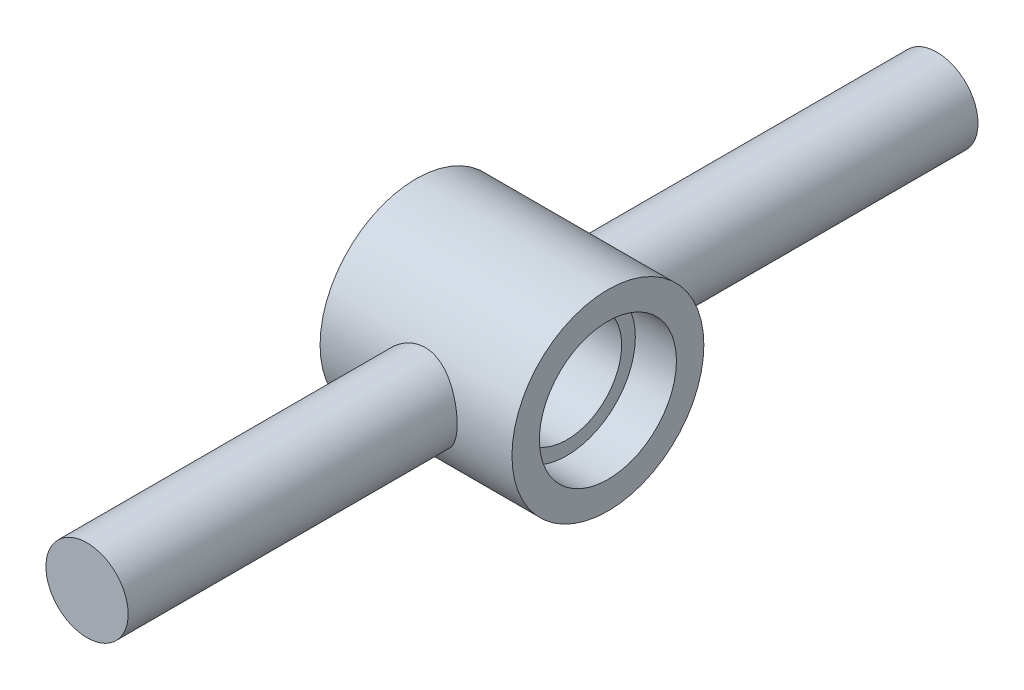
ISO-10303-21;
HEADER;
FILE_DESCRIPTION(('STEP AP214'),'2;1');
FILE_NAME('part.step','',(''),(''),'','','');
FILE_SCHEMA(('AUTOMOTIVE_DESIGN { 1 0 10303 214 1 1 1 1 }'));
ENDSEC;
DATA;
#1=APPLICATION_CONTEXT('core data for automotive mechanical design processes');
#2=APPLICATION_PROTOCOL_DEFINITION('international standard','automotive_design',2000,#1);
#3=PRODUCT_CONTEXT('',#1,'mechanical');
#4=PRODUCT('Part','Part','',(#3));
#5=PRODUCT_RELATED_PRODUCT_CATEGORY('part','',(#4));
#6=PRODUCT_DEFINITION_FORMATION('','',#4);
#7=PRODUCT_DEFINITION_CONTEXT('part definition',#1,'design');
#8=PRODUCT_DEFINITION('design','',#6,#7);
#9=PRODUCT_DEFINITION_SHAPE('','',#8);
#10=(LENGTH_UNIT() NAMED_UNIT(*) SI_UNIT(.MILLI.,.METRE.));
#11=(NAMED_UNIT(*) PLANE_ANGLE_UNIT() SI_UNIT($,.RADIAN.));
#12=(NAMED_UNIT(*) SI_UNIT($,.STERADIAN.) SOLID_ANGLE_UNIT());
#13=UNCERTAINTY_MEASURE_WITH_UNIT(LENGTH_MEASURE(1.E-05),#10,'distance_accuracy_value','');
#14=(GEOMETRIC_REPRESENTATION_CONTEXT(3) GLOBAL_UNCERTAINTY_ASSIGNED_CONTEXT((#13)) GLOBAL_UNIT_ASSIGNED_CONTEXT((#10,
#11,#12)) REPRESENTATION_CONTEXT('',''));
#15=CARTESIAN_POINT('',(0.,0.,0.));
#16=DIRECTION('',(0.,0.,1.));
#17=DIRECTION('',(1.,0.,0.));
#18=AXIS2_PLACEMENT_3D('',#15,#16,#17);
#19=CARTESIAN_POINT('',(-7.,0.,0.));
#20=DIRECTION('',(1.,0.,0.));
#21=DIRECTION('',(0.,0.,-1.));
#22=AXIS2_PLACEMENT_3D('',#19,#20,#21);
#23=CYLINDRICAL_SURFACE('',#22,4.);
#24=CARTESIAN_POINT('',(4.,0.,0.));
#25=DIRECTION('',(1.,0.,0.));
#26=DIRECTION('',(0.,0.,-1.));
#27=AXIS2_PLACEMENT_3D('',#24,#25,#26);
#28=CIRCLE('',#27,4.);
#29=CARTESIAN_POINT('',(4.,0.,-4.));
#30=VERTEX_POINT('',#29);
#31=EDGE_CURVE('E64',#30,#30,#28,.F.);
#32=ORIENTED_EDGE('',*,*,#31,.F.);
#33=EDGE_LOOP('',(#32));
#34=FACE_BOUND('',#33,.T.);
#35=CARTESIAN_POINT('',(-4.,0.,0.));
#36=DIRECTION('',(-1.,0.,0.));
#37=DIRECTION('',(0.,0.,1.));
#38=AXIS2_PLACEMENT_3D('',#35,#36,#37);
#39=CIRCLE('',#38,4.);
#40=CARTESIAN_POINT('',(-4.,0.,4.));
#41=VERTEX_POINT('',#40);
#42=EDGE_CURVE('E43',#41,#41,#39,.F.);
#43=ORIENTED_EDGE('',*,*,#42,.F.);
#44=EDGE_LOOP('',(#43));
#45=FACE_BOUND('',#44,.T.);
#46=ADVANCED_FACE('F39',(#34,#45),#23,.F.);
#47=CARTESIAN_POINT('',(-7.,0.,0.));
#48=DIRECTION('',(-1.,0.,0.));
#49=DIRECTION('',(0.,0.,1.));
#50=AXIS2_PLACEMENT_3D('',#47,#48,#49);
#51=CYLINDRICAL_SURFACE('',#50,7.);
#52=CARTESIAN_POINT('',(-7.,0.,0.));
#53=DIRECTION('',(-1.,0.,0.));
#54=DIRECTION('',(0.,0.,1.));
#55=AXIS2_PLACEMENT_3D('',#52,#53,#54);
#56=CIRCLE('',#55,7.);
#57=CARTESIAN_POINT('',(-7.,0.,7.));
#58=VERTEX_POINT('',#57);
#59=EDGE_CURVE('E144',#58,#58,#56,.T.);
#60=ORIENTED_EDGE('',*,*,#59,.F.);
#61=EDGE_LOOP('',(#60));
#62=FACE_BOUND('',#61,.T.);
#63=CARTESIAN_POINT('',(7.,0.,0.));
#64=DIRECTION('',(-1.,0.,0.));
#65=DIRECTION('',(0.,0.,1.));
#66=AXIS2_PLACEMENT_3D('',#63,#64,#65);
#67=CIRCLE('',#66,7.);
#68=CARTESIAN_POINT('',(7.,0.,7.));
#69=VERTEX_POINT('',#68);
#70=EDGE_CURVE('E55',#69,#69,#67,.T.);
#71=ORIENTED_EDGE('',*,*,#70,.T.);
#72=EDGE_LOOP('',(#71));
#73=FACE_BOUND('',#72,.T.);
#74=CARTESIAN_POINT('',(3.,0.,-7.));
#75=CARTESIAN_POINT('',(2.99999253041854,-0.160281740269091,-6.9999940839629));
#76=CARTESIAN_POINT('',(2.98707868390345,-0.320833907522429,-6.99443250051265));
#77=CARTESIAN_POINT('',(2.93591763457354,-0.637349314958984,-6.97273920628719));
#78=CARTESIAN_POINT('',(2.89760647092665,-0.793299928144206,-6.95658080950724));
#79=CARTESIAN_POINT('',(2.79733023637488,-1.09553470514829,-6.91541630739346));
#80=CARTESIAN_POINT('',(2.7354471561946,-1.24185033642246,-6.89044089228941));
#81=CARTESIAN_POINT('',(2.59013558143627,-1.5218733278968,-6.83405660276648));
#82=CARTESIAN_POINT('',(2.5067129239082,-1.6555840905338,-6.80264947176647));
#83=CARTESIAN_POINT('',(2.3160723523121,-1.91384144205639,-6.7346782187555));
#84=CARTESIAN_POINT('',(2.20790474010422,-2.03764045493602,-6.69793895962371));
#85=CARTESIAN_POINT('',(1.97285613149922,-2.26599040232609,-6.62417654338771));
#86=CARTESIAN_POINT('',(1.84596481539728,-2.3705306503261,-6.5871532404671));
#87=CARTESIAN_POINT('',(1.5689672772845,-2.56285686126492,-6.51482055271223));
#88=CARTESIAN_POINT('',(1.41798954197069,-2.64946811752636,-6.47970460244925));
#89=CARTESIAN_POINT('',(1.10189057181104,-2.79573199408101,-6.41796168635027));
#90=CARTESIAN_POINT('',(0.936777095513755,-2.8553992914263,-6.39133010120133));
#91=CARTESIAN_POINT('',(0.605699261690756,-2.94294919918374,-6.35147799087276));
#92=CARTESIAN_POINT('',(0.440192298220547,-2.97227494401776,-6.3376522143554));
#93=CARTESIAN_POINT('',(0.106074030389652,-3.00280607158394,-6.32324849688131));
#94=CARTESIAN_POINT('',(-0.0625353552913797,-3.00402828615096,-6.32266262625149));
#95=CARTESIAN_POINT('',(-0.38329990371855,-2.97939999510613,-6.33429573902539));
#96=CARTESIAN_POINT('',(-0.535670623331994,-2.95576113815072,-6.34546870930158));
#97=CARTESIAN_POINT('',(-0.834027585901331,-2.88580772808799,-6.37758411517576));
#98=CARTESIAN_POINT('',(-0.980012513886143,-2.83948852833539,-6.39852855266592));
#99=CARTESIAN_POINT('',(-1.26524715143523,-2.7245765907069,-6.44830685655466));
#100=CARTESIAN_POINT('',(-1.40428029421815,-2.65551974428426,-6.47730295111391));
#101=CARTESIAN_POINT('',(-1.66934632406943,-2.49742304873013,-6.53988493882129));
#102=CARTESIAN_POINT('',(-1.79537389492949,-2.40837507480489,-6.57347269593628));
#103=CARTESIAN_POINT('',(-2.04277750362138,-2.20343405392229,-6.64512404535213));
#104=CARTESIAN_POINT('',(-2.16271672947197,-2.08584728856133,-6.68331855389209));
#105=CARTESIAN_POINT('',(-2.38167159065594,-1.83187332405076,-6.75734605758523));
#106=CARTESIAN_POINT('',(-2.48068174587821,-1.6954812162799,-6.79317843254652));
#107=CARTESIAN_POINT('',(-2.65724393280697,-1.40318582301271,-6.8595969368957));
#108=CARTESIAN_POINT('',(-2.73417901870558,-1.24687114970231,-6.89002455033727));
#109=CARTESIAN_POINT('',(-2.86015023761472,-0.921879694158936,-6.94097396260558));
#110=CARTESIAN_POINT('',(-2.9092027059777,-0.753210215657665,-6.96150156039981));
#111=CARTESIAN_POINT('',(-2.97493386045897,-0.42027623894137,-6.98923526893385));
#112=CARTESIAN_POINT('',(-2.99353876531439,-0.256457961010924,-6.99723249964589));
#113=CARTESIAN_POINT('',(-3.00362957640823,0.0721433011185075,-7.00155416651739));
#114=CARTESIAN_POINT('',(-2.99512385253237,0.236925971900556,-6.99788220531666));
#115=CARTESIAN_POINT('',(-2.95258436794519,0.553542439626672,-6.9797867632015));
#116=CARTESIAN_POINT('',(-2.91993167855167,0.705598931504218,-6.96594519473644));
#117=CARTESIAN_POINT('',(-2.83197910576183,1.00189113639242,-6.92953888009974));
#118=CARTESIAN_POINT('',(-2.77667640427784,1.14612587370002,-6.90697304848521));
#119=CARTESIAN_POINT('',(-2.64319884049788,1.42777696523888,-6.8543875151372));
#120=CARTESIAN_POINT('',(-2.56436366977394,1.56483974951836,-6.82415705388474));
#121=CARTESIAN_POINT('',(-2.38678105552406,1.82428490564705,-6.75942988391438));
#122=CARTESIAN_POINT('',(-2.28802511197671,1.94666097512992,-6.72493135648758));
#123=CARTESIAN_POINT('',(-2.06471041215711,2.18296759532595,-6.65214788697903));
#124=CARTESIAN_POINT('',(-1.93876778993861,2.29556617553686,-6.61377354998591));
#125=CARTESIAN_POINT('',(-1.66921770136839,2.49843431443676,-6.53984037690253));
#126=CARTESIAN_POINT('',(-1.52560533962517,2.58869766421195,-6.50428232556792));
#127=CARTESIAN_POINT('',(-1.22118614704143,2.74563875632303,-6.4396296928532));
#128=CARTESIAN_POINT('',(-1.06011699095001,2.81186415020233,-6.41066255987443));
#129=CARTESIAN_POINT('',(-0.727473673260502,2.91565885028324,-6.36413607530145));
#130=CARTESIAN_POINT('',(-0.555909001675426,2.95325364225748,-6.346566580073));
#131=CARTESIAN_POINT('',(-0.222008827667051,2.9961194841997,-6.32643481136621));
#132=CARTESIAN_POINT('',(-0.0600407324894144,3.00374693238451,-6.3227792566546));
#133=CARTESIAN_POINT('',(0.262789746911494,2.99282649265778,-6.32795618271386));
#134=CARTESIAN_POINT('',(0.423652321119278,2.97428322126543,-6.33678646098226));
#135=CARTESIAN_POINT('',(0.731041696273357,2.91356431394149,-6.36491653890771));
#136=CARTESIAN_POINT('',(0.877878791570751,2.87266975661121,-6.38364713099396));
#137=CARTESIAN_POINT('',(1.16262076608388,2.769702223632,-6.42898875831973));
#138=CARTESIAN_POINT('',(1.30052309240773,2.70762322652258,-6.45560203384715));
#139=CARTESIAN_POINT('',(1.57282070867955,2.55963250501149,-6.5157524732596));
#140=CARTESIAN_POINT('',(1.70646915369476,2.47248232196069,-6.5496164957701));
#141=CARTESIAN_POINT('',(1.95798236124753,2.2784960092513,-6.61959778926567));
#142=CARTESIAN_POINT('',(2.07584112704921,2.17165243666714,-6.6557159087398));
#143=CARTESIAN_POINT('',(2.30200363550072,1.93135048700133,-6.72955424641834));
#144=CARTESIAN_POINT('',(2.40881956557276,1.79645724733279,-6.76717599448736));
#145=CARTESIAN_POINT('',(2.59843976003117,1.50919760355001,-6.83696477009089));
#146=CARTESIAN_POINT('',(2.68123313759985,1.35682332068822,-6.86912932173673));
#147=CARTESIAN_POINT('',(2.78459269098953,1.11954532843042,-6.91035442086788));
#148=CARTESIAN_POINT('',(2.81543329080184,1.03957288024831,-6.92286397965452));
#149=CARTESIAN_POINT('',(2.87023820202229,0.876970802782698,-6.94533202163241));
#150=CARTESIAN_POINT('',(2.89420579227535,0.794342461515168,-6.95529172101822));
#151=CARTESIAN_POINT('',(2.93494771728342,0.627265567421398,-6.97234378079151));
#152=CARTESIAN_POINT('',(2.95173958438048,0.542821986677286,-6.97944312738119));
#153=CARTESIAN_POINT('',(2.97800871420341,0.372647906839314,-6.99059319635284));
#154=CARTESIAN_POINT('',(2.9874912240139,0.286918376030205,-6.99464610559385));
#155=CARTESIAN_POINT('',(2.99550827494356,0.167492669563776,-6.99807592564235));
#156=CARTESIAN_POINT('',(2.99719185411763,0.134021137958667,-6.99879677015532));
#157=CARTESIAN_POINT('',(2.99943850128407,0.0670370145842115,-6.99975942751561));
#158=CARTESIAN_POINT('',(3.00000156233271,0.0335244225617061,-7.0000012373944));
#159=CARTESIAN_POINT('',(3.,0.,-7.));
#160=B_SPLINE_CURVE_WITH_KNOTS('',3,(#74,#75,#76,#77,#78,#79,#80,#81,#82,#83,#84,#85,#86,#87,
#88,#89,#90,#91,#92,#93,#94,#95,#96,#97,#98,#99,#100,#101,#102,#103,#104,#105,#106,#107,#108,
#109,#110,#111,#112,#113,#114,#115,#116,#117,#118,#119,#120,#121,#122,#123,#124,#125,#126,#127,
#128,#129,#130,#131,#132,#133,#134,#135,#136,#137,#138,#139,#140,#141,#142,#143,#144,#145,#146,
#147,#148,#149,#150,#151,#152,#153,#154,#155,#156,#157,#158,#159),.UNSPECIFIED.,.T.,.F.,(4,2,2,
2,2,2,2,2,2,2,2,2,2,2,2,2,2,2,2,2,2,2,2,2,2,2,2,2,2,2,2,2,2,2,2,2,2,2,2,2,2,2,4),(0.,
0.480714322748849,0.962643903423346,1.44291226275142,1.92305060961531,2.42622743558506,
2.92968263421743,3.45969560860062,3.98941952228263,4.492594268281,4.99546764377915,
5.45710720323576,5.91884138089948,6.3906540887232,6.86265889892285,7.37709837725841,
7.89167239108963,8.41947244601234,8.94696296364742,9.43957347502028,9.93203191709568,
10.3983119423363,10.8646499992176,11.3455505516221,11.8266567358409,12.3440285038672,
12.8615439335848,13.3883469079738,13.9146803943341,14.3986848887267,14.882604015318,
15.341320451094,15.8001673810816,16.2874475008663,16.7749121624767,17.3008416934143,
17.8270092002163,18.0865840789243,18.3460349177801,18.6048481685098,18.8634754544625,
18.964020720529,19.0645666096629),.UNSPECIFIED.);
#161=CARTESIAN_POINT('',(3.,0.,-7.));
#162=VERTEX_POINT('',#161);
#163=EDGE_CURVE('E48',#162,#162,#160,.T.);
#164=ORIENTED_EDGE('',*,*,#163,.F.);
#165=EDGE_LOOP('',(#164));
#166=FACE_BOUND('',#165,.T.);
#167=CARTESIAN_POINT('',(3.,0.,7.));
#168=CARTESIAN_POINT('',(2.99999253041854,0.160281740269091,6.9999940839629));
#169=CARTESIAN_POINT('',(2.98707868390345,0.320833907522429,6.99443250051265));
#170=CARTESIAN_POINT('',(2.93591763457354,0.637349314958984,6.97273920628719));
#171=CARTESIAN_POINT('',(2.89760647092665,0.793299928144206,6.95658080950724));
#172=CARTESIAN_POINT('',(2.79733023637488,1.09553470514829,6.91541630739346));
#173=CARTESIAN_POINT('',(2.7354471561946,1.24185033642246,6.89044089228941));
#174=CARTESIAN_POINT('',(2.59013558143627,1.5218733278968,6.83405660276648));
#175=CARTESIAN_POINT('',(2.5067129239082,1.6555840905338,6.80264947176647));
#176=CARTESIAN_POINT('',(2.3160723523121,1.91384144205639,6.7346782187555));
#177=CARTESIAN_POINT('',(2.20790474010422,2.03764045493602,6.69793895962371));
#178=CARTESIAN_POINT('',(1.97285613149922,2.26599040232609,6.62417654338771));
#179=CARTESIAN_POINT('',(1.84596481539728,2.3705306503261,6.5871532404671));
#180=CARTESIAN_POINT('',(1.5689672772845,2.56285686126492,6.51482055271223));
#181=CARTESIAN_POINT('',(1.41798954197069,2.64946811752636,6.47970460244925));
#182=CARTESIAN_POINT('',(1.10189057181104,2.79573199408101,6.41796168635027));
#183=CARTESIAN_POINT('',(0.936777095513755,2.8553992914263,6.39133010120133));
#184=CARTESIAN_POINT('',(0.605699261690756,2.94294919918374,6.35147799087276));
#185=CARTESIAN_POINT('',(0.440192298220547,2.97227494401776,6.3376522143554));
#186=CARTESIAN_POINT('',(0.106074030389652,3.00280607158394,6.32324849688131));
#187=CARTESIAN_POINT('',(-0.0625353552913797,3.00402828615096,6.32266262625149));
#188=CARTESIAN_POINT('',(-0.38329990371855,2.97939999510613,6.33429573902539));
#189=CARTESIAN_POINT('',(-0.535670623331994,2.95576113815072,6.34546870930158));
#190=CARTESIAN_POINT('',(-0.834027585901331,2.88580772808799,6.37758411517576));
#191=CARTESIAN_POINT('',(-0.980012513886143,2.83948852833539,6.39852855266592));
#192=CARTESIAN_POINT('',(-1.26524715143523,2.7245765907069,6.44830685655466));
#193=CARTESIAN_POINT('',(-1.40428029421815,2.65551974428426,6.47730295111391));
#194=CARTESIAN_POINT('',(-1.66934632406943,2.49742304873013,6.53988493882129));
#195=CARTESIAN_POINT('',(-1.79537389492949,2.40837507480489,6.57347269593628));
#196=CARTESIAN_POINT('',(-2.04277750362138,2.20343405392229,6.64512404535213));
#197=CARTESIAN_POINT('',(-2.16271672947197,2.08584728856133,6.68331855389209));
#198=CARTESIAN_POINT('',(-2.38167159065594,1.83187332405076,6.75734605758523));
#199=CARTESIAN_POINT('',(-2.48068174587821,1.6954812162799,6.79317843254652));
#200=CARTESIAN_POINT('',(-2.65724393280697,1.40318582301271,6.8595969368957));
#201=CARTESIAN_POINT('',(-2.73417901870558,1.24687114970231,6.89002455033727));
#202=CARTESIAN_POINT('',(-2.86015023761472,0.921879694158936,6.94097396260558));
#203=CARTESIAN_POINT('',(-2.9092027059777,0.753210215657665,6.96150156039981));
#204=CARTESIAN_POINT('',(-2.97493386045897,0.42027623894137,6.98923526893385));
#205=CARTESIAN_POINT('',(-2.99353876531439,0.256457961010924,6.99723249964589));
#206=CARTESIAN_POINT('',(-3.00362957640823,-0.0721433011185075,7.00155416651739));
#207=CARTESIAN_POINT('',(-2.99512385253237,-0.236925971900556,6.99788220531666));
#208=CARTESIAN_POINT('',(-2.95258436794519,-0.553542439626672,6.9797867632015));
#209=CARTESIAN_POINT('',(-2.91993167855167,-0.705598931504218,6.96594519473644));
#210=CARTESIAN_POINT('',(-2.83197910576183,-1.00189113639242,6.92953888009974));
#211=CARTESIAN_POINT('',(-2.77667640427784,-1.14612587370002,6.90697304848521));
#212=CARTESIAN_POINT('',(-2.64319884049788,-1.42777696523888,6.8543875151372));
#213=CARTESIAN_POINT('',(-2.56436366977394,-1.56483974951836,6.82415705388474));
#214=CARTESIAN_POINT('',(-2.38678105552406,-1.82428490564705,6.75942988391438));
#215=CARTESIAN_POINT('',(-2.28802511197671,-1.94666097512992,6.72493135648758));
#216=CARTESIAN_POINT('',(-2.06471041215711,-2.18296759532595,6.65214788697903));
#217=CARTESIAN_POINT('',(-1.93876778993861,-2.29556617553686,6.61377354998591));
#218=CARTESIAN_POINT('',(-1.66921770136839,-2.49843431443676,6.53984037690253));
#219=CARTESIAN_POINT('',(-1.52560533962517,-2.58869766421195,6.50428232556792));
#220=CARTESIAN_POINT('',(-1.22118614704143,-2.74563875632303,6.4396296928532));
#221=CARTESIAN_POINT('',(-1.06011699095001,-2.81186415020233,6.41066255987443));
#222=CARTESIAN_POINT('',(-0.727473673260502,-2.91565885028324,6.36413607530145));
#223=CARTESIAN_POINT('',(-0.555909001675426,-2.95325364225748,6.346566580073));
#224=CARTESIAN_POINT('',(-0.222008827667051,-2.9961194841997,6.32643481136621));
#225=CARTESIAN_POINT('',(-0.0600407324894144,-3.00374693238451,6.3227792566546));
#226=CARTESIAN_POINT('',(0.262789746911494,-2.99282649265778,6.32795618271386));
#227=CARTESIAN_POINT('',(0.423652321119278,-2.97428322126543,6.33678646098226));
#228=CARTESIAN_POINT('',(0.731041696273357,-2.91356431394149,6.36491653890771));
#229=CARTESIAN_POINT('',(0.877878791570751,-2.87266975661121,6.38364713099396));
#230=CARTESIAN_POINT('',(1.16262076608388,-2.769702223632,6.42898875831973));
#231=CARTESIAN_POINT('',(1.30052309240773,-2.70762322652258,6.45560203384715));
#232=CARTESIAN_POINT('',(1.57282070867955,-2.55963250501149,6.5157524732596));
#233=CARTESIAN_POINT('',(1.70646915369476,-2.47248232196069,6.5496164957701));
#234=CARTESIAN_POINT('',(1.95798236124753,-2.2784960092513,6.61959778926567));
#235=CARTESIAN_POINT('',(2.07584112704921,-2.17165243666714,6.6557159087398));
#236=CARTESIAN_POINT('',(2.30200363550072,-1.93135048700133,6.72955424641834));
#237=CARTESIAN_POINT('',(2.40881956557276,-1.79645724733279,6.76717599448736));
#238=CARTESIAN_POINT('',(2.59843976003117,-1.50919760355001,6.83696477009089));
#239=CARTESIAN_POINT('',(2.68123313759985,-1.35682332068822,6.86912932173673));
#240=CARTESIAN_POINT('',(2.78459269098953,-1.11954532843042,6.91035442086788));
#241=CARTESIAN_POINT('',(2.81543329080184,-1.03957288024831,6.92286397965452));
#242=CARTESIAN_POINT('',(2.87023820202229,-0.876970802782698,6.94533202163241));
#243=CARTESIAN_POINT('',(2.89420579227535,-0.794342461515168,6.95529172101822));
#244=CARTESIAN_POINT('',(2.93494771728342,-0.627265567421398,6.97234378079151));
#245=CARTESIAN_POINT('',(2.95173958438048,-0.542821986677286,6.97944312738119));
#246=CARTESIAN_POINT('',(2.97800871420341,-0.372647906839314,6.99059319635284));
#247=CARTESIAN_POINT('',(2.9874912240139,-0.286918376030205,6.99464610559385));
#248=CARTESIAN_POINT('',(2.99550827494356,-0.167492669563776,6.99807592564235));
#249=CARTESIAN_POINT('',(2.99719185411763,-0.134021137958667,6.99879677015532));
#250=CARTESIAN_POINT('',(2.99943850128407,-0.0670370145842115,6.99975942751561));
#251=CARTESIAN_POINT('',(3.00000156233271,-0.0335244225617061,7.0000012373944));
#252=CARTESIAN_POINT('',(3.,0.,7.));
#253=B_SPLINE_CURVE_WITH_KNOTS('',3,(#167,#168,#169,#170,#171,#172,#173,#174,#175,#176,#177,
#178,#179,#180,#181,#182,#183,#184,#185,#186,#187,#188,#189,#190,#191,#192,#193,#194,#195,#196,
#197,#198,#199,#200,#201,#202,#203,#204,#205,#206,#207,#208,#209,#210,#211,#212,#213,#214,#215,
#216,#217,#218,#219,#220,#221,#222,#223,#224,#225,#226,#227,#228,#229,#230,#231,#232,#233,#234,
#235,#236,#237,#238,#239,#240,#241,#242,#243,#244,#245,#246,#247,#248,#249,#250,#251,#252),
.UNSPECIFIED.,.T.,.F.,(4,2,2,2,2,2,2,2,2,2,2,2,2,2,2,2,2,2,2,2,2,2,2,2,2,2,2,2,2,2,2,2,2,2,2,2,
2,2,2,2,2,2,4),(0.,0.480714322748849,0.962643903423346,1.44291226275142,1.92305060961531,
2.42622743558506,2.92968263421743,3.45969560860062,3.98941952228263,4.492594268281,
4.99546764377915,5.45710720323576,5.91884138089948,6.3906540887232,6.86265889892285,
7.37709837725841,7.89167239108963,8.41947244601234,8.94696296364742,9.43957347502028,
9.93203191709568,10.3983119423363,10.8646499992176,11.3455505516221,11.8266567358409,
12.3440285038672,12.8615439335848,13.3883469079738,13.9146803943341,14.3986848887267,
14.882604015318,15.341320451094,15.8001673810816,16.2874475008663,16.7749121624767,
17.3008416934143,17.8270092002163,18.0865840789243,18.3460349177801,18.6048481685098,
18.8634754544625,18.964020720529,19.0645666096629),.UNSPECIFIED.);
#254=CARTESIAN_POINT('',(3.,0.,7.));
#255=VERTEX_POINT('',#254);
#256=EDGE_CURVE('E10',#255,#255,#253,.T.);
#257=ORIENTED_EDGE('',*,*,#256,.F.);
#258=EDGE_LOOP('',(#257));
#259=FACE_BOUND('',#258,.T.);
#260=ADVANCED_FACE('F65',(#62,#73,#166,#259),#51,.T.);
#261=CARTESIAN_POINT('',(-7.,0.,0.));
#262=DIRECTION('',(1.,0.,0.));
#263=DIRECTION('',(0.,0.,-1.));
#264=AXIS2_PLACEMENT_3D('',#261,#262,#263);
#265=PLANE('',#264);
#266=CARTESIAN_POINT('',(-7.,0.,0.));
#267=DIRECTION('',(1.,0.,0.));
#268=DIRECTION('',(0.,0.,-1.));
#269=AXIS2_PLACEMENT_3D('',#266,#267,#268);
#270=CIRCLE('',#269,5.);
#271=CARTESIAN_POINT('',(-7.,0.,-5.));
#272=VERTEX_POINT('',#271);
#273=EDGE_CURVE('E128',#272,#272,#270,.T.);
#274=ORIENTED_EDGE('',*,*,#273,.T.);
#275=EDGE_LOOP('',(#274));
#276=FACE_BOUND('',#275,.T.);
#277=ORIENTED_EDGE('',*,*,#59,.T.);
#278=EDGE_LOOP('',(#277));
#279=FACE_BOUND('',#278,.T.);
#280=ADVANCED_FACE('F41',(#276,#279),#265,.F.);
#281=CARTESIAN_POINT('',(7.,0.,0.));
#282=DIRECTION('',(-1.,0.,0.));
#283=DIRECTION('',(0.,0.,1.));
#284=AXIS2_PLACEMENT_3D('',#281,#282,#283);
#285=PLANE('',#284);
#286=CARTESIAN_POINT('',(7.,0.,0.));
#287=DIRECTION('',(1.,0.,0.));
#288=DIRECTION('',(0.,0.,-1.));
#289=AXIS2_PLACEMENT_3D('',#286,#287,#288);
#290=CIRCLE('',#289,5.);
#291=CARTESIAN_POINT('',(7.,0.,-5.));
#292=VERTEX_POINT('',#291);
#293=EDGE_CURVE('E121',#292,#292,#290,.T.);
#294=ORIENTED_EDGE('',*,*,#293,.F.);
#295=EDGE_LOOP('',(#294));
#296=FACE_BOUND('',#295,.T.);
#297=ORIENTED_EDGE('',*,*,#70,.F.);
#298=EDGE_LOOP('',(#297));
#299=FACE_BOUND('',#298,.T.);
#300=ADVANCED_FACE('F79',(#296,#299),#285,.F.);
#301=CARTESIAN_POINT('',(0.,0.,-31.));
#302=DIRECTION('',(0.,0.,1.));
#303=DIRECTION('',(1.,0.,0.));
#304=AXIS2_PLACEMENT_3D('',#301,#302,#303);
#305=PLANE('',#304);
#306=CARTESIAN_POINT('',(0.,0.,-31.));
#307=DIRECTION('',(0.,0.,1.));
#308=DIRECTION('',(1.,0.,0.));
#309=AXIS2_PLACEMENT_3D('',#306,#307,#308);
#310=CIRCLE('',#309,3.);
#311=CARTESIAN_POINT('',(3.,0.,-31.));
#312=VERTEX_POINT('',#311);
#313=EDGE_CURVE('E140',#312,#312,#310,.T.);
#314=ORIENTED_EDGE('',*,*,#313,.F.);
#315=EDGE_LOOP('',(#314));
#316=FACE_BOUND('',#315,.T.);
#317=ADVANCED_FACE('F76',(#316),#305,.F.);
#318=CARTESIAN_POINT('',(0.,0.,31.));
#319=DIRECTION('',(0.,0.,1.));
#320=DIRECTION('',(1.,0.,0.));
#321=AXIS2_PLACEMENT_3D('',#318,#319,#320);
#322=CYLINDRICAL_SURFACE('',#321,3.);
#323=ORIENTED_EDGE('',*,*,#313,.T.);
#324=EDGE_LOOP('',(#323));
#325=FACE_BOUND('',#324,.T.);
#326=ORIENTED_EDGE('',*,*,#163,.T.);
#327=EDGE_LOOP('',(#326));
#328=FACE_BOUND('',#327,.T.);
#329=ADVANCED_FACE('F73',(#325,#328),#322,.T.);
#330=CARTESIAN_POINT('',(0.,0.,31.));
#331=DIRECTION('',(0.,0.,1.));
#332=DIRECTION('',(1.,0.,0.));
#333=AXIS2_PLACEMENT_3D('',#330,#331,#332);
#334=CIRCLE('',#333,3.);
#335=CARTESIAN_POINT('',(3.,0.,31.));
#336=VERTEX_POINT('',#335);
#337=EDGE_CURVE('E136',#336,#336,#334,.T.);
#338=ORIENTED_EDGE('',*,*,#337,.F.);
#339=EDGE_LOOP('',(#338));
#340=FACE_BOUND('',#339,.T.);
#341=ORIENTED_EDGE('',*,*,#256,.T.);
#342=EDGE_LOOP('',(#341));
#343=FACE_BOUND('',#342,.T.);
#344=ADVANCED_FACE('F68',(#340,#343),#322,.T.);
#345=CARTESIAN_POINT('',(0.,0.,31.));
#346=DIRECTION('',(0.,0.,1.));
#347=DIRECTION('',(1.,0.,0.));
#348=AXIS2_PLACEMENT_3D('',#345,#346,#347);
#349=PLANE('',#348);
#350=ORIENTED_EDGE('',*,*,#337,.T.);
#351=EDGE_LOOP('',(#350));
#352=FACE_BOUND('',#351,.T.);
#353=ADVANCED_FACE('F72',(#352),#349,.T.);
#354=CARTESIAN_POINT('',(4.,0.,0.));
#355=DIRECTION('',(1.,0.,0.));
#356=DIRECTION('',(0.,0.,-1.));
#357=AXIS2_PLACEMENT_3D('',#354,#355,#356);
#358=PLANE('',#357);
#359=CARTESIAN_POINT('',(4.,0.,0.));
#360=DIRECTION('',(1.,0.,0.));
#361=DIRECTION('',(0.,0.,-1.));
#362=AXIS2_PLACEMENT_3D('',#359,#360,#361);
#363=CIRCLE('',#362,5.);
#364=CARTESIAN_POINT('',(4.,0.,-5.));
#365=VERTEX_POINT('',#364);
#366=EDGE_CURVE('E126',#365,#365,#363,.T.);
#367=ORIENTED_EDGE('',*,*,#366,.T.);
#368=EDGE_LOOP('',(#367));
#369=FACE_BOUND('',#368,.T.);
#370=ORIENTED_EDGE('',*,*,#31,.T.);
#371=EDGE_LOOP('',(#370));
#372=FACE_BOUND('',#371,.T.);
#373=ADVANCED_FACE('F101',(#369,#372),#358,.T.);
#374=CARTESIAN_POINT('',(4.,0.,0.));
#375=DIRECTION('',(1.,0.,0.));
#376=DIRECTION('',(0.,0.,-1.));
#377=AXIS2_PLACEMENT_3D('',#374,#375,#376);
#378=CYLINDRICAL_SURFACE('',#377,5.);
#379=ORIENTED_EDGE('',*,*,#366,.F.);
#380=EDGE_LOOP('',(#379));
#381=FACE_BOUND('',#380,.T.);
#382=ORIENTED_EDGE('',*,*,#293,.T.);
#383=EDGE_LOOP('',(#382));
#384=FACE_BOUND('',#383,.T.);
#385=ADVANCED_FACE('F97',(#381,#384),#378,.F.);
#386=CARTESIAN_POINT('',(-4.,0.,0.));
#387=DIRECTION('',(-1.,0.,0.));
#388=DIRECTION('',(0.,0.,-1.));
#389=AXIS2_PLACEMENT_3D('',#386,#387,#388);
#390=PLANE('',#389);
#391=CARTESIAN_POINT('',(-4.,0.,0.));
#392=DIRECTION('',(1.,0.,0.));
#393=DIRECTION('',(0.,0.,-1.));
#394=AXIS2_PLACEMENT_3D('',#391,#392,#393);
#395=CIRCLE('',#394,5.);
#396=CARTESIAN_POINT('',(-4.,0.,-5.));
#397=VERTEX_POINT('',#396);
#398=EDGE_CURVE('E117',#397,#397,#395,.T.);
#399=ORIENTED_EDGE('',*,*,#398,.F.);
#400=EDGE_LOOP('',(#399));
#401=FACE_BOUND('',#400,.T.);
#402=ORIENTED_EDGE('',*,*,#42,.T.);
#403=EDGE_LOOP('',(#402));
#404=FACE_BOUND('',#403,.T.);
#405=ADVANCED_FACE('F100',(#401,#404),#390,.T.);
#406=CARTESIAN_POINT('',(-4.,0.,0.));
#407=DIRECTION('',(-1.,0.,0.));
#408=DIRECTION('',(0.,0.,1.));
#409=AXIS2_PLACEMENT_3D('',#406,#407,#408);
#410=CYLINDRICAL_SURFACE('',#409,5.);
#411=ORIENTED_EDGE('',*,*,#398,.T.);
#412=EDGE_LOOP('',(#411));
#413=FACE_BOUND('',#412,.T.);
#414=ORIENTED_EDGE('',*,*,#273,.F.);
#415=EDGE_LOOP('',(#414));
#416=FACE_BOUND('',#415,.T.);
#417=ADVANCED_FACE('F106',(#413,#416),#410,.F.);
#418=CLOSED_SHELL('',(#46,#260,#280,#300,#317,#329,#344,#353,#373,#385,#405,#417));
#419=MANIFOLD_SOLID_BREP('B2',#418);
#420=ADVANCED_BREP_SHAPE_REPRESENTATION('',(#18,#419),#14);
#421=SHAPE_DEFINITION_REPRESENTATION(#9,#420);
ENDSEC;
END-ISO-10303-21;
